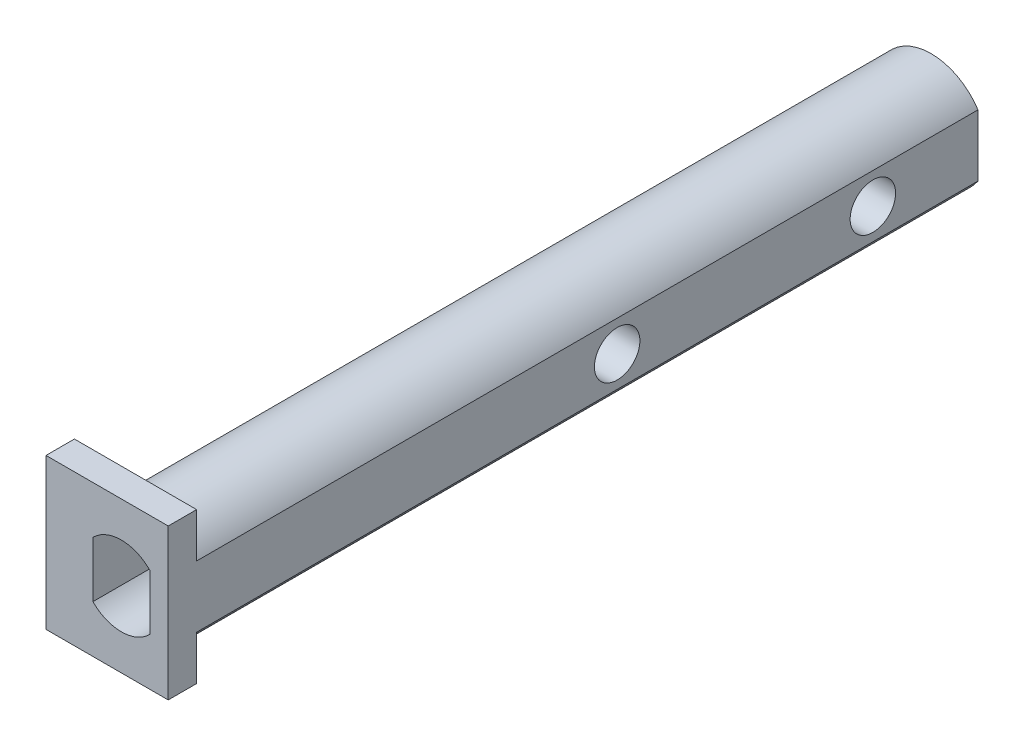
ISO-10303-21;
HEADER;
FILE_DESCRIPTION(('STEP AP214'),'2;1');
FILE_NAME('part.step','',(''),(''),'','','');
FILE_SCHEMA(('AUTOMOTIVE_DESIGN { 1 0 10303 214 1 1 1 1 }'));
ENDSEC;
DATA;
#1=APPLICATION_CONTEXT('core data for automotive mechanical design processes');
#2=APPLICATION_PROTOCOL_DEFINITION('international standard','automotive_design',2000,#1);
#3=PRODUCT_CONTEXT('',#1,'mechanical');
#4=PRODUCT('Part','Part','',(#3));
#5=PRODUCT_RELATED_PRODUCT_CATEGORY('part','',(#4));
#6=PRODUCT_DEFINITION_FORMATION('','',#4);
#7=PRODUCT_DEFINITION_CONTEXT('part definition',#1,'design');
#8=PRODUCT_DEFINITION('design','',#6,#7);
#9=PRODUCT_DEFINITION_SHAPE('','',#8);
#10=(LENGTH_UNIT() NAMED_UNIT(*) SI_UNIT(.MILLI.,.METRE.));
#11=(NAMED_UNIT(*) PLANE_ANGLE_UNIT() SI_UNIT($,.RADIAN.));
#12=(NAMED_UNIT(*) SI_UNIT($,.STERADIAN.) SOLID_ANGLE_UNIT());
#13=UNCERTAINTY_MEASURE_WITH_UNIT(LENGTH_MEASURE(1.E-05),#10,'distance_accuracy_value','');
#14=(GEOMETRIC_REPRESENTATION_CONTEXT(3) GLOBAL_UNCERTAINTY_ASSIGNED_CONTEXT((#13)) GLOBAL_UNIT_ASSIGNED_CONTEXT((#10,
#11,#12)) REPRESENTATION_CONTEXT('',''));
#15=CARTESIAN_POINT('',(0.,0.,0.));
#16=DIRECTION('',(0.,0.,1.));
#17=DIRECTION('',(1.,0.,0.));
#18=AXIS2_PLACEMENT_3D('',#15,#16,#17);
#19=CARTESIAN_POINT('',(-5.3033008588991,-5.30330085889911,2.));
#20=DIRECTION('',(1.,0.,0.));
#21=DIRECTION('',(0.,0.,-1.));
#22=AXIS2_PLACEMENT_3D('',#19,#20,#21);
#23=PLANE('',#22);
#24=DIRECTION('',(0.,-1.,0.));
#25=VECTOR('',#24,1.);
#26=CARTESIAN_POINT('',(-5.3033008588991,-5.30330085889911,0.));
#27=LINE('',#26,#25);
#28=CARTESIAN_POINT('',(-5.3033008588991,5.30330085889911,0.));
#29=VERTEX_POINT('',#28);
#30=CARTESIAN_POINT('',(-5.3033008588991,-5.30330085889911,0.));
#31=VERTEX_POINT('',#30);
#32=EDGE_CURVE('E127',#29,#31,#27,.T.);
#33=ORIENTED_EDGE('',*,*,#32,.T.);
#34=DIRECTION('',(0.,0.,-1.));
#35=VECTOR('',#34,1.);
#36=CARTESIAN_POINT('',(-5.3033008588991,-5.30330085889911,2.));
#37=LINE('',#36,#35);
#38=CARTESIAN_POINT('',(-5.3033008588991,-5.30330085889911,2.));
#39=VERTEX_POINT('',#38);
#40=EDGE_CURVE('E42',#39,#31,#37,.T.);
#41=ORIENTED_EDGE('',*,*,#40,.F.);
#42=DIRECTION('',(0.,-1.,0.));
#43=VECTOR('',#42,1.);
#44=CARTESIAN_POINT('',(-5.3033008588991,-5.30330085889911,2.));
#45=LINE('',#44,#43);
#46=CARTESIAN_POINT('',(-5.3033008588991,5.30330085889911,2.));
#47=VERTEX_POINT('',#46);
#48=EDGE_CURVE('E139',#47,#39,#45,.T.);
#49=ORIENTED_EDGE('',*,*,#48,.F.);
#50=DIRECTION('',(0.,0.,-1.));
#51=VECTOR('',#50,1.);
#52=CARTESIAN_POINT('',(-5.3033008588991,5.30330085889911,2.));
#53=LINE('',#52,#51);
#54=EDGE_CURVE('E147',#47,#29,#53,.T.);
#55=ORIENTED_EDGE('',*,*,#54,.T.);
#56=EDGE_LOOP('',(#33,#41,#49,#55));
#57=FACE_BOUND('',#56,.T.);
#58=ADVANCED_FACE('F34',(#57),#23,.F.);
#59=CARTESIAN_POINT('',(5.30330085889911,-5.3033008588991,2.));
#60=DIRECTION('',(0.,1.,0.));
#61=DIRECTION('',(-1.,0.,0.));
#62=AXIS2_PLACEMENT_3D('',#59,#60,#61);
#63=PLANE('',#62);
#64=DIRECTION('',(1.,0.,0.));
#65=VECTOR('',#64,1.);
#66=CARTESIAN_POINT('',(5.30330085889911,-5.3033008588991,0.));
#67=LINE('',#66,#65);
#68=CARTESIAN_POINT('',(3.3,-5.30330085889911,0.));
#69=VERTEX_POINT('',#68);
#70=EDGE_CURVE('E131',#31,#69,#67,.T.);
#71=ORIENTED_EDGE('',*,*,#70,.T.);
#72=DIRECTION('',(0.,0.,1.));
#73=VECTOR('',#72,1.);
#74=CARTESIAN_POINT('',(3.3,-5.3033008588991,2.));
#75=LINE('',#74,#73);
#76=CARTESIAN_POINT('',(3.3,-5.30330085889911,2.));
#77=VERTEX_POINT('',#76);
#78=EDGE_CURVE('E220',#69,#77,#75,.T.);
#79=ORIENTED_EDGE('',*,*,#78,.T.);
#80=DIRECTION('',(1.,0.,0.));
#81=VECTOR('',#80,1.);
#82=CARTESIAN_POINT('',(5.30330085889911,-5.3033008588991,2.));
#83=LINE('',#82,#81);
#84=EDGE_CURVE('E142',#39,#77,#83,.T.);
#85=ORIENTED_EDGE('',*,*,#84,.F.);
#86=ORIENTED_EDGE('',*,*,#40,.T.);
#87=EDGE_LOOP('',(#71,#79,#85,#86));
#88=FACE_BOUND('',#87,.T.);
#89=ADVANCED_FACE('F204',(#88),#63,.F.);
#90=CARTESIAN_POINT('',(5.30330085889911,5.30330085889911,2.));
#91=DIRECTION('',(0.,-1.,0.));
#92=DIRECTION('',(1.,0.,0.));
#93=AXIS2_PLACEMENT_3D('',#90,#91,#92);
#94=PLANE('',#93);
#95=DIRECTION('',(-1.,0.,0.));
#96=VECTOR('',#95,1.);
#97=CARTESIAN_POINT('',(5.30330085889911,5.30330085889911,2.));
#98=LINE('',#97,#96);
#99=CARTESIAN_POINT('',(3.3,5.30330085889911,2.));
#100=VERTEX_POINT('',#99);
#101=EDGE_CURVE('E146',#100,#47,#98,.T.);
#102=ORIENTED_EDGE('',*,*,#101,.F.);
#103=DIRECTION('',(0.,0.,-1.));
#104=VECTOR('',#103,1.);
#105=CARTESIAN_POINT('',(3.3,5.30330085889911,2.));
#106=LINE('',#105,#104);
#107=CARTESIAN_POINT('',(3.3,5.30330085889911,0.));
#108=VERTEX_POINT('',#107);
#109=EDGE_CURVE('E228',#100,#108,#106,.T.);
#110=ORIENTED_EDGE('',*,*,#109,.T.);
#111=DIRECTION('',(-1.,0.,0.));
#112=VECTOR('',#111,1.);
#113=CARTESIAN_POINT('',(5.30330085889911,5.30330085889911,0.));
#114=LINE('',#113,#112);
#115=EDGE_CURVE('E143',#108,#29,#114,.T.);
#116=ORIENTED_EDGE('',*,*,#115,.T.);
#117=ORIENTED_EDGE('',*,*,#54,.F.);
#118=EDGE_LOOP('',(#102,#110,#116,#117));
#119=FACE_BOUND('',#118,.T.);
#120=ADVANCED_FACE('F209',(#119),#94,.F.);
#121=CARTESIAN_POINT('',(0.,0.,2.));
#122=DIRECTION('',(0.,0.,1.));
#123=DIRECTION('',(1.,0.,0.));
#124=AXIS2_PLACEMENT_3D('',#121,#122,#123);
#125=PLANE('',#124);
#126=DIRECTION('',(0.,1.,0.));
#127=VECTOR('',#126,1.);
#128=CARTESIAN_POINT('',(3.3,6.81051230128347,2.));
#129=LINE('',#128,#127);
#130=EDGE_CURVE('E117',#77,#100,#129,.T.);
#131=ORIENTED_EDGE('',*,*,#130,.T.);
#132=ORIENTED_EDGE('',*,*,#101,.T.);
#133=ORIENTED_EDGE('',*,*,#48,.T.);
#134=ORIENTED_EDGE('',*,*,#84,.T.);
#135=EDGE_LOOP('',(#131,#132,#133,#134));
#136=FACE_BOUND('',#135,.T.);
#137=CARTESIAN_POINT('',(0.,0.,2.));
#138=DIRECTION('',(0.,0.,1.));
#139=DIRECTION('',(1.,0.,0.));
#140=AXIS2_PLACEMENT_3D('',#137,#138,#139);
#141=CIRCLE('',#140,2.8);
#142=CARTESIAN_POINT('',(2.,1.95959179422654,2.));
#143=VERTEX_POINT('',#142);
#144=CARTESIAN_POINT('',(-2.,1.95959179422654,2.));
#145=VERTEX_POINT('',#144);
#146=EDGE_CURVE('E58',#143,#145,#141,.T.);
#147=ORIENTED_EDGE('',*,*,#146,.F.);
#148=DIRECTION('',(0.,1.,0.));
#149=VECTOR('',#148,1.);
#150=CARTESIAN_POINT('',(2.,-1.95959179422654,2.));
#151=LINE('',#150,#149);
#152=CARTESIAN_POINT('',(2.,-1.95959179422654,2.));
#153=VERTEX_POINT('',#152);
#154=EDGE_CURVE('E238',#153,#143,#151,.T.);
#155=ORIENTED_EDGE('',*,*,#154,.F.);
#156=CARTESIAN_POINT('',(0.,0.,2.));
#157=DIRECTION('',(0.,0.,1.));
#158=DIRECTION('',(1.,0.,0.));
#159=AXIS2_PLACEMENT_3D('',#156,#157,#158);
#160=CIRCLE('',#159,2.8);
#161=CARTESIAN_POINT('',(-2.,-1.95959179422654,2.));
#162=VERTEX_POINT('',#161);
#163=EDGE_CURVE('E251',#162,#153,#160,.T.);
#164=ORIENTED_EDGE('',*,*,#163,.F.);
#165=DIRECTION('',(0.,-1.,0.));
#166=VECTOR('',#165,1.);
#167=CARTESIAN_POINT('',(-2.,-1.95959179422654,2.));
#168=LINE('',#167,#166);
#169=EDGE_CURVE('E248',#145,#162,#168,.T.);
#170=ORIENTED_EDGE('',*,*,#169,.F.);
#171=EDGE_LOOP('',(#147,#155,#164,#170));
#172=FACE_BOUND('',#171,.T.);
#173=ADVANCED_FACE('F223',(#136,#172),#125,.T.);
#174=CARTESIAN_POINT('',(0.,0.,0.));
#175=DIRECTION('',(0.,0.,1.));
#176=DIRECTION('',(1.,0.,0.));
#177=AXIS2_PLACEMENT_3D('',#174,#175,#176);
#178=PLANE('',#177);
#179=ORIENTED_EDGE('',*,*,#115,.F.);
#180=DIRECTION('',(0.,-1.,0.));
#181=VECTOR('',#180,1.);
#182=CARTESIAN_POINT('',(3.3,0.,0.));
#183=LINE('',#182,#181);
#184=CARTESIAN_POINT('',(3.3,2.17082933460924,0.));
#185=VERTEX_POINT('',#184);
#186=EDGE_CURVE('E123',#108,#185,#183,.T.);
#187=ORIENTED_EDGE('',*,*,#186,.T.);
#188=CARTESIAN_POINT('',(0.,0.,0.));
#189=DIRECTION('',(0.,0.,1.));
#190=DIRECTION('',(1.,0.,0.));
#191=AXIS2_PLACEMENT_3D('',#188,#189,#190);
#192=CIRCLE('',#191,3.95);
#193=CARTESIAN_POINT('',(3.3,-2.17082933460924,0.));
#194=VERTEX_POINT('',#193);
#195=EDGE_CURVE('E11',#194,#185,#192,.F.);
#196=ORIENTED_EDGE('',*,*,#195,.F.);
#197=EDGE_CURVE('E218',#194,#69,#183,.T.);
#198=ORIENTED_EDGE('',*,*,#197,.T.);
#199=ORIENTED_EDGE('',*,*,#70,.F.);
#200=ORIENTED_EDGE('',*,*,#32,.F.);
#201=EDGE_LOOP('',(#179,#187,#196,#198,#199,#200));
#202=FACE_BOUND('',#201,.T.);
#203=ADVANCED_FACE('F201',(#202),#178,.F.);
#204=CARTESIAN_POINT('',(0.,0.,-55.));
#205=DIRECTION('',(0.,0.,1.));
#206=DIRECTION('',(1.,0.,0.));
#207=AXIS2_PLACEMENT_3D('',#204,#205,#206);
#208=CYLINDRICAL_SURFACE('',#207,3.95);
#209=CARTESIAN_POINT('',(-3.95,0.,-49.2));
#210=CARTESIAN_POINT('',(-3.94999379590642,0.0859077321557278,-49.1999916550053));
#211=CARTESIAN_POINT('',(-3.94716465691992,0.171960508165551,-49.1930398920778));
#212=CARTESIAN_POINT('',(-3.93612262605428,0.341636442293053,-49.1654753191493));
#213=CARTESIAN_POINT('',(-3.92789527110763,0.425252441381751,-49.144825808078));
#214=CARTESIAN_POINT('',(-3.90694267817301,0.587325652133528,-49.0907442720734));
#215=CARTESIAN_POINT('',(-3.89423233289274,0.665798936827774,-49.0573545410689));
#216=CARTESIAN_POINT('',(-3.86556133416429,0.81595753399801,-48.9789102133528));
#217=CARTESIAN_POINT('',(-3.84960176596475,0.887645101239574,-48.9338595100754));
#218=CARTESIAN_POINT('',(-3.81518363905526,1.02574826393297,-48.8310848181557));
#219=CARTESIAN_POINT('',(-3.79664621239121,1.09179510750592,-48.772891931647));
#220=CARTESIAN_POINT('',(-3.75951612001247,1.21350548338532,-48.6464749128529));
#221=CARTESIAN_POINT('',(-3.7409234313628,1.26916382180316,-48.5782457931209));
#222=CARTESIAN_POINT('',(-3.70483728932636,1.37103573094096,-48.4298919890851));
#223=CARTESIAN_POINT('',(-3.68743345926833,1.41669853996952,-48.349365049844));
#224=CARTESIAN_POINT('',(-3.65693685641008,1.49366649852331,-48.1809639893364));
#225=CARTESIAN_POINT('',(-3.64384198477753,1.52497864098217,-48.0930934712556));
#226=CARTESIAN_POINT('',(-3.62429472437666,1.57085557676029,-47.9167394050751));
#227=CARTESIAN_POINT('',(-3.61756330485353,1.58612751431657,-47.8284718912971));
#228=CARTESIAN_POINT('',(-3.61069817456082,1.6016987007412,-47.6503901386177));
#229=CARTESIAN_POINT('',(-3.61056110427824,1.60200557361225,-47.5605767106184));
#230=CARTESIAN_POINT('',(-3.6166626916494,1.58817282611031,-47.3888209567203));
#231=CARTESIAN_POINT('',(-3.62244496832578,1.57506731922361,-47.3067759511718));
#232=CARTESIAN_POINT('',(-3.63896616369862,1.53650919256078,-47.1461687548221));
#233=CARTESIAN_POINT('',(-3.64970597192727,1.51105435689702,-47.0676071918307));
#234=CARTESIAN_POINT('',(-3.67517016363188,1.44803161287774,-46.914274076503));
#235=CARTESIAN_POINT('',(-3.68997237200738,1.41022403947253,-46.8396145330093));
#236=CARTESIAN_POINT('',(-3.72187311796671,1.32373763358919,-46.6974201713575));
#237=CARTESIAN_POINT('',(-3.7389725305385,1.27505465404351,-46.6298880855826));
#238=CARTESIAN_POINT('',(-3.77519514377456,1.16365466611768,-46.4982190793749));
#239=CARTESIAN_POINT('',(-3.79437119679803,1.10012994730087,-46.4347782069349));
#240=CARTESIAN_POINT('',(-3.83143400894788,0.963142929101401,-46.3192240338791));
#241=CARTESIAN_POINT('',(-3.84932049759423,0.889678554164187,-46.2671131050723));
#242=CARTESIAN_POINT('',(-3.88225775533471,0.732881158291159,-46.174752880911));
#243=CARTESIAN_POINT('',(-3.89724206881569,0.649375159500435,-46.1347718111597));
#244=CARTESIAN_POINT('',(-3.922181990994,0.476061375318491,-46.0696660350169));
#245=CARTESIAN_POINT('',(-3.93214022119439,0.386256902981339,-46.0445335827183));
#246=CARTESIAN_POINT('',(-3.94542459215147,0.208724533739429,-46.0112608744955));
#247=CARTESIAN_POINT('',(-3.94911512677478,0.121199066921185,-46.0021856046835));
#248=CARTESIAN_POINT('',(-3.95060071041494,-0.0541938764246967,-45.9985159867403));
#249=CARTESIAN_POINT('',(-3.94839733598265,-0.142061255216749,-46.0039177661707));
#250=CARTESIAN_POINT('',(-3.93858059347028,-0.311363708061816,-46.028366706555));
#251=CARTESIAN_POINT('',(-3.93122258224669,-0.392908191563032,-46.0467701266381));
#252=CARTESIAN_POINT('',(-3.91210369996182,-0.551672579317277,-46.0958180319386));
#253=CARTESIAN_POINT('',(-3.90034226583763,-0.628891929065906,-46.126464082647));
#254=CARTESIAN_POINT('',(-3.87310408548293,-0.779489223977342,-46.2001286880824));
#255=CARTESIAN_POINT('',(-3.85752418102271,-0.852675933877134,-46.2434988371676));
#256=CARTESIAN_POINT('',(-3.82433041096255,-0.990991615978242,-46.3409916578839));
#257=CARTESIAN_POINT('',(-3.80671572028317,-1.0561172972074,-46.3951186977487));
#258=CARTESIAN_POINT('',(-3.76988841835221,-1.18108814082411,-46.516881259089));
#259=CARTESIAN_POINT('',(-3.75064833634512,-1.24027776609804,-46.5851830301985));
#260=CARTESIAN_POINT('',(-3.71383176873331,-1.34652272225713,-46.7310804612434));
#261=CARTESIAN_POINT('',(-3.69625558731186,-1.39357583712715,-46.8086778146841));
#262=CARTESIAN_POINT('',(-3.66470495525766,-1.47456996129036,-46.9722589192486));
#263=CARTESIAN_POINT('',(-3.65077223389056,-1.50836110249075,-47.0583255038484));
#264=CARTESIAN_POINT('',(-3.62870953262366,-1.56070148841118,-47.2356641018007));
#265=CARTESIAN_POINT('',(-3.62057512140545,-1.57926237439182,-47.3269320822858));
#266=CARTESIAN_POINT('',(-3.61168155811158,-1.59948964035799,-47.5048536785259));
#267=CARTESIAN_POINT('',(-3.61042424247238,-1.60229755591094,-47.5913533604062));
#268=CARTESIAN_POINT('',(-3.61411655329279,-1.59395185398862,-47.7635327606292));
#269=CARTESIAN_POINT('',(-3.61906534523779,-1.58280011362214,-47.8492125876542));
#270=CARTESIAN_POINT('',(-3.63416797193795,-1.54779216749586,-48.0136630301261));
#271=CARTESIAN_POINT('',(-3.64409678783653,-1.52448358396572,-48.0925727976111));
#272=CARTESIAN_POINT('',(-3.66787680868113,-1.46634274381066,-48.2453893632212));
#273=CARTESIAN_POINT('',(-3.68172910265356,-1.43150728725855,-48.3192947652346));
#274=CARTESIAN_POINT('',(-3.71279532694713,-1.34896281261509,-48.4646902255109));
#275=CARTESIAN_POINT('',(-3.73015791598264,-1.30062288942569,-48.5357898002129));
#276=CARTESIAN_POINT('',(-3.76584691631165,-1.19335216104212,-48.6692260227832));
#277=CARTESIAN_POINT('',(-3.78417363020855,-1.13441801651281,-48.7315598965992));
#278=CARTESIAN_POINT('',(-3.82120608968873,-1.00292100616807,-48.8499972793726));
#279=CARTESIAN_POINT('',(-3.83985454069275,-0.929708413753424,-48.9054005829582));
#280=CARTESIAN_POINT('',(-3.87417673576788,-0.774322530110476,-49.0031559583822));
#281=CARTESIAN_POINT('',(-3.88984910570161,-0.692145127024248,-49.0455020069333));
#282=CARTESIAN_POINT('',(-3.91619878681009,-0.522605310186937,-49.1149682227071));
#283=CARTESIAN_POINT('',(-3.92696120811018,-0.435363361478893,-49.1423495919973));
#284=CARTESIAN_POINT('',(-3.94262733791631,-0.257151225703105,-49.18181810637));
#285=CARTESIAN_POINT('',(-3.94754956284656,-0.166193772628575,-49.1939535959662));
#286=CARTESIAN_POINT('',(-3.94976439647011,-0.0500034308579897,-49.1994164730771));
#287=CARTESIAN_POINT('',(-3.95000180602032,-0.025007860938832,-49.2000024292396));
#288=CARTESIAN_POINT('',(-3.95,0.,-49.2));
#289=B_SPLINE_CURVE_WITH_KNOTS('',3,(#209,#210,#211,#212,#213,#214,#215,#216,#217,#218,#219,
#220,#221,#222,#223,#224,#225,#226,#227,#228,#229,#230,#231,#232,#233,#234,#235,#236,#237,#238,
#239,#240,#241,#242,#243,#244,#245,#246,#247,#248,#249,#250,#251,#252,#253,#254,#255,#256,#257,
#258,#259,#260,#261,#262,#263,#264,#265,#266,#267,#268,#269,#270,#271,#272,#273,#274,#275,#276,
#277,#278,#279,#280,#281,#282,#283,#284,#285,#286,#287,#288),.UNSPECIFIED.,.T.,.F.,(4,2,2,2,2,2,
2,2,2,2,2,2,2,2,2,2,2,2,2,2,2,2,2,2,2,2,2,2,2,2,2,2,2,2,2,2,2,2,2,4),(0.,0.257655045685027,
0.516003243154265,0.773501156162766,1.03091320490201,1.29960683517439,1.5684344450968,
1.84960097097946,2.13063034122349,2.39867107103374,2.66657524516243,2.91527296827918,
3.16401533270003,3.41790287629517,3.67188739939658,3.94605133721535,4.22027261333428,
4.50017732626545,4.77993589531559,5.04278958082347,5.30557296311517,5.55618241623339,
5.8068239255751,6.06517547226243,6.32363214732916,6.59957820054954,6.87557460336945,
7.15460582542831,7.43342357050492,7.69174703190008,7.95003576112402,8.19758313300221,
8.44519928320903,8.70721714442973,8.969317739863,9.24903212422417,9.52887534793322,
9.80366390035451,10.0775788837508,10.1525826277793),.UNSPECIFIED.);
#290=CARTESIAN_POINT('',(-3.95,0.,-49.2));
#291=VERTEX_POINT('',#290);
#292=EDGE_CURVE('E163',#291,#291,#289,.T.);
#293=ORIENTED_EDGE('',*,*,#292,.T.);
#294=EDGE_LOOP('',(#293));
#295=FACE_BOUND('',#294,.T.);
#296=CARTESIAN_POINT('',(-3.95,0.,-31.2));
#297=CARTESIAN_POINT('',(-3.94999379590642,0.0859077321557284,-31.1999916550053));
#298=CARTESIAN_POINT('',(-3.94716465691992,0.171960508165553,-31.1930398920778));
#299=CARTESIAN_POINT('',(-3.93612262605428,0.341636442293055,-31.1654753191493));
#300=CARTESIAN_POINT('',(-3.92789527110763,0.425252441381753,-31.144825808078));
#301=CARTESIAN_POINT('',(-3.90694267817301,0.587325652133531,-31.0907442720734));
#302=CARTESIAN_POINT('',(-3.89423233289273,0.665798936827779,-31.0573545410689));
#303=CARTESIAN_POINT('',(-3.86556133416429,0.815957533998016,-30.9789102133528));
#304=CARTESIAN_POINT('',(-3.84960176596475,0.887645101239579,-30.9338595100754));
#305=CARTESIAN_POINT('',(-3.81518363905526,1.02574826393297,-30.8310848181557));
#306=CARTESIAN_POINT('',(-3.79664621239121,1.09179510750592,-30.772891931647));
#307=CARTESIAN_POINT('',(-3.75951612001247,1.21350548338532,-30.6464749128529));
#308=CARTESIAN_POINT('',(-3.7409234313628,1.26916382180316,-30.5782457931209));
#309=CARTESIAN_POINT('',(-3.70483728932636,1.37103573094096,-30.4298919890852));
#310=CARTESIAN_POINT('',(-3.68743345926833,1.41669853996952,-30.349365049844));
#311=CARTESIAN_POINT('',(-3.65693685641008,1.49366649852332,-30.1809639893365));
#312=CARTESIAN_POINT('',(-3.64384198477753,1.52497864098217,-30.0930934712556));
#313=CARTESIAN_POINT('',(-3.62429472437666,1.5708555767603,-29.9167394050751));
#314=CARTESIAN_POINT('',(-3.61756330485353,1.58612751431658,-29.8284718912971));
#315=CARTESIAN_POINT('',(-3.61069817456082,1.60169870074121,-29.6503901386177));
#316=CARTESIAN_POINT('',(-3.61056110427824,1.60200557361225,-29.5605767106184));
#317=CARTESIAN_POINT('',(-3.6166626916494,1.58817282611031,-29.3888209567203));
#318=CARTESIAN_POINT('',(-3.62244496832578,1.57506731922361,-29.3067759511717));
#319=CARTESIAN_POINT('',(-3.63896616369862,1.53650919256078,-29.1461687548221));
#320=CARTESIAN_POINT('',(-3.64970597192726,1.51105435689702,-29.0676071918307));
#321=CARTESIAN_POINT('',(-3.67517016363188,1.44803161287774,-28.914274076503));
#322=CARTESIAN_POINT('',(-3.68997237200737,1.41022403947254,-28.8396145330093));
#323=CARTESIAN_POINT('',(-3.72187311796671,1.3237376335892,-28.6974201713575));
#324=CARTESIAN_POINT('',(-3.7389725305385,1.27505465404351,-28.6298880855826));
#325=CARTESIAN_POINT('',(-3.77519514377456,1.16365466611768,-28.4982190793749));
#326=CARTESIAN_POINT('',(-3.79437119679803,1.10012994730087,-28.4347782069349));
#327=CARTESIAN_POINT('',(-3.83143400894788,0.963142929101403,-28.3192240338791));
#328=CARTESIAN_POINT('',(-3.84932049759423,0.889678554164188,-28.2671131050723));
#329=CARTESIAN_POINT('',(-3.88225775533471,0.732881158291159,-28.1747528809109));
#330=CARTESIAN_POINT('',(-3.89724206881569,0.649375159500433,-28.1347718111597));
#331=CARTESIAN_POINT('',(-3.922181990994,0.476061375318488,-28.0696660350169));
#332=CARTESIAN_POINT('',(-3.93214022119439,0.386256902981336,-28.0445335827183));
#333=CARTESIAN_POINT('',(-3.94542459215147,0.208724533739426,-28.0112608744955));
#334=CARTESIAN_POINT('',(-3.94911512677478,0.121199066921182,-28.0021856046835));
#335=CARTESIAN_POINT('',(-3.95060071041494,-0.0541938764246999,-27.9985159867403));
#336=CARTESIAN_POINT('',(-3.94839733598265,-0.142061255216753,-28.0039177661707));
#337=CARTESIAN_POINT('',(-3.93858059347028,-0.31136370806182,-28.028366706555));
#338=CARTESIAN_POINT('',(-3.93122258224669,-0.392908191563037,-28.0467701266381));
#339=CARTESIAN_POINT('',(-3.91210369996182,-0.551672579317282,-28.0958180319386));
#340=CARTESIAN_POINT('',(-3.90034226583763,-0.628891929065911,-28.126464082647));
#341=CARTESIAN_POINT('',(-3.87310408548293,-0.779489223977345,-28.2001286880824));
#342=CARTESIAN_POINT('',(-3.85752418102271,-0.852675933877137,-28.2434988371676));
#343=CARTESIAN_POINT('',(-3.82433041096255,-0.990991615978245,-28.3409916578839));
#344=CARTESIAN_POINT('',(-3.80671572028317,-1.0561172972074,-28.3951186977487));
#345=CARTESIAN_POINT('',(-3.76988841835221,-1.18108814082412,-28.516881259089));
#346=CARTESIAN_POINT('',(-3.75064833634512,-1.24027776609804,-28.5851830301985));
#347=CARTESIAN_POINT('',(-3.71383176873331,-1.34652272225713,-28.7310804612434));
#348=CARTESIAN_POINT('',(-3.69625558731186,-1.39357583712716,-28.8086778146841));
#349=CARTESIAN_POINT('',(-3.66470495525766,-1.47456996129036,-28.9722589192486));
#350=CARTESIAN_POINT('',(-3.65077223389055,-1.50836110249075,-29.0583255038484));
#351=CARTESIAN_POINT('',(-3.62870953262366,-1.56070148841118,-29.2356641018007));
#352=CARTESIAN_POINT('',(-3.62057512140545,-1.57926237439182,-29.3269320822858));
#353=CARTESIAN_POINT('',(-3.61168155811158,-1.599489640358,-29.5048536785259));
#354=CARTESIAN_POINT('',(-3.61042424247238,-1.60229755591095,-29.5913533604062));
#355=CARTESIAN_POINT('',(-3.61411655329279,-1.59395185398862,-29.7635327606292));
#356=CARTESIAN_POINT('',(-3.61906534523779,-1.58280011362214,-29.8492125876542));
#357=CARTESIAN_POINT('',(-3.63416797193795,-1.54779216749586,-30.0136630301262));
#358=CARTESIAN_POINT('',(-3.64409678783653,-1.52448358396572,-30.0925727976111));
#359=CARTESIAN_POINT('',(-3.66787680868112,-1.46634274381066,-30.2453893632212));
#360=CARTESIAN_POINT('',(-3.68172910265356,-1.43150728725855,-30.3192947652346));
#361=CARTESIAN_POINT('',(-3.71279532694713,-1.3489628126151,-30.4646902255109));
#362=CARTESIAN_POINT('',(-3.73015791598264,-1.3006228894257,-30.5357898002129));
#363=CARTESIAN_POINT('',(-3.76584691631165,-1.19335216104213,-30.6692260227832));
#364=CARTESIAN_POINT('',(-3.78417363020855,-1.13441801651281,-30.7315598965992));
#365=CARTESIAN_POINT('',(-3.82120608968873,-1.00292100616808,-30.8499972793726));
#366=CARTESIAN_POINT('',(-3.83985454069275,-0.929708413753423,-30.9054005829582));
#367=CARTESIAN_POINT('',(-3.87417673576788,-0.774322530110471,-31.0031559583822));
#368=CARTESIAN_POINT('',(-3.88984910570161,-0.692145127024244,-31.0455020069333));
#369=CARTESIAN_POINT('',(-3.91619878681009,-0.522605310186934,-31.1149682227071));
#370=CARTESIAN_POINT('',(-3.92696120811018,-0.43536336147889,-31.1423495919973));
#371=CARTESIAN_POINT('',(-3.94262733791631,-0.257151225703103,-31.18181810637));
#372=CARTESIAN_POINT('',(-3.94754956284656,-0.166193772628575,-31.1939535959662));
#373=CARTESIAN_POINT('',(-3.94976439647011,-0.05000343085799,-31.1994164730771));
#374=CARTESIAN_POINT('',(-3.95000180602032,-0.0250078609388322,-31.2000024292396));
#375=CARTESIAN_POINT('',(-3.95,0.,-31.2));
#376=B_SPLINE_CURVE_WITH_KNOTS('',3,(#296,#297,#298,#299,#300,#301,#302,#303,#304,#305,#306,
#307,#308,#309,#310,#311,#312,#313,#314,#315,#316,#317,#318,#319,#320,#321,#322,#323,#324,#325,
#326,#327,#328,#329,#330,#331,#332,#333,#334,#335,#336,#337,#338,#339,#340,#341,#342,#343,#344,
#345,#346,#347,#348,#349,#350,#351,#352,#353,#354,#355,#356,#357,#358,#359,#360,#361,#362,#363,
#364,#365,#366,#367,#368,#369,#370,#371,#372,#373,#374,#375),.UNSPECIFIED.,.T.,.F.,(4,2,2,2,2,2,
2,2,2,2,2,2,2,2,2,2,2,2,2,2,2,2,2,2,2,2,2,2,2,2,2,2,2,2,2,2,2,2,2,4),(0.,0.257655045685028,
0.516003243154268,0.773501156162772,1.03091320490202,1.2996068351744,1.5684344450968,
1.84960097097947,2.1306303412235,2.39867107103377,2.66657524516244,2.91527296827919,
3.16401533270004,3.41790287629517,3.67188739939659,3.94605133721536,4.22027261333429,
4.50017732626547,4.7799358953156,5.04278958082349,5.30557296311519,5.55618241623341,
5.80682392557512,6.06517547226244,6.32363214732917,6.59957820054956,6.87557460336947,
7.15460582542833,7.43342357050493,7.69174703190009,7.95003576112405,8.19758313300223,
8.44519928320904,8.70721714442974,8.96931773986302,9.2490321242242,9.52887534793325,
9.80366390035453,10.0775788837508,10.1525826277793),.UNSPECIFIED.);
#377=CARTESIAN_POINT('',(-3.95,0.,-31.2));
#378=VERTEX_POINT('',#377);
#379=EDGE_CURVE('E156',#378,#378,#376,.T.);
#380=ORIENTED_EDGE('',*,*,#379,.T.);
#381=EDGE_LOOP('',(#380));
#382=FACE_BOUND('',#381,.T.);
#383=CARTESIAN_POINT('',(0.,0.,-55.));
#384=DIRECTION('',(0.,0.,-1.));
#385=DIRECTION('',(-1.,0.,0.));
#386=AXIS2_PLACEMENT_3D('',#383,#384,#385);
#387=CIRCLE('',#386,3.95);
#388=CARTESIAN_POINT('',(3.3,-2.17082933460924,-55.));
#389=VERTEX_POINT('',#388);
#390=CARTESIAN_POINT('',(3.3,2.17082933460924,-55.));
#391=VERTEX_POINT('',#390);
#392=EDGE_CURVE('E121',#389,#391,#387,.T.);
#393=ORIENTED_EDGE('',*,*,#392,.F.);
#394=DIRECTION('',(0.,0.,1.));
#395=VECTOR('',#394,1.);
#396=CARTESIAN_POINT('',(3.3,-2.17082933460924,-55.));
#397=LINE('',#396,#395);
#398=EDGE_CURVE('E50',#389,#194,#397,.T.);
#399=ORIENTED_EDGE('',*,*,#398,.T.);
#400=ORIENTED_EDGE('',*,*,#195,.T.);
#401=DIRECTION('',(0.,0.,1.));
#402=VECTOR('',#401,1.);
#403=CARTESIAN_POINT('',(3.3,2.17082933460924,-55.));
#404=LINE('',#403,#402);
#405=EDGE_CURVE('E112',#185,#391,#404,.F.);
#406=ORIENTED_EDGE('',*,*,#405,.T.);
#407=EDGE_LOOP('',(#393,#399,#400,#406));
#408=FACE_BOUND('',#407,.T.);
#409=ADVANCED_FACE('F120',(#295,#382,#408),#208,.T.);
#410=CARTESIAN_POINT('',(0.,0.,-55.));
#411=DIRECTION('',(0.,0.,-1.));
#412=DIRECTION('',(-1.,0.,0.));
#413=AXIS2_PLACEMENT_3D('',#410,#411,#412);
#414=PLANE('',#413);
#415=DIRECTION('',(0.,1.,0.));
#416=VECTOR('',#415,1.);
#417=CARTESIAN_POINT('',(3.3,6.81051230128347,-55.));
#418=LINE('',#417,#416);
#419=EDGE_CURVE('E109',#389,#391,#418,.T.);
#420=ORIENTED_EDGE('',*,*,#419,.F.);
#421=ORIENTED_EDGE('',*,*,#392,.T.);
#422=EDGE_LOOP('',(#420,#421));
#423=FACE_BOUND('',#422,.T.);
#424=ADVANCED_FACE('F126',(#423),#414,.T.);
#425=CARTESIAN_POINT('',(0.,0.,-8.));
#426=DIRECTION('',(0.,0.,1.));
#427=DIRECTION('',(1.,0.,0.));
#428=AXIS2_PLACEMENT_3D('',#425,#426,#427);
#429=CYLINDRICAL_SURFACE('',#428,2.8);
#430=ORIENTED_EDGE('',*,*,#146,.T.);
#431=DIRECTION('',(0.,0.,1.));
#432=VECTOR('',#431,1.);
#433=CARTESIAN_POINT('',(-2.,1.95959179422654,-8.));
#434=LINE('',#433,#432);
#435=CARTESIAN_POINT('',(-2.,1.95959179422654,-8.));
#436=VERTEX_POINT('',#435);
#437=EDGE_CURVE('E137',#436,#145,#434,.T.);
#438=ORIENTED_EDGE('',*,*,#437,.F.);
#439=CARTESIAN_POINT('',(0.,0.,-8.));
#440=DIRECTION('',(0.,0.,1.));
#441=DIRECTION('',(1.,0.,0.));
#442=AXIS2_PLACEMENT_3D('',#439,#440,#441);
#443=CIRCLE('',#442,2.8);
#444=CARTESIAN_POINT('',(2.,1.95959179422654,-8.));
#445=VERTEX_POINT('',#444);
#446=EDGE_CURVE('E234',#445,#436,#443,.T.);
#447=ORIENTED_EDGE('',*,*,#446,.F.);
#448=DIRECTION('',(0.,0.,1.));
#449=VECTOR('',#448,1.);
#450=CARTESIAN_POINT('',(2.,1.95959179422654,-8.));
#451=LINE('',#450,#449);
#452=EDGE_CURVE('E128',#445,#143,#451,.T.);
#453=ORIENTED_EDGE('',*,*,#452,.T.);
#454=EDGE_LOOP('',(#430,#438,#447,#453));
#455=FACE_BOUND('',#454,.T.);
#456=ADVANCED_FACE('F188',(#455),#429,.F.);
#457=CARTESIAN_POINT('',(2.,-1.95959179422654,-8.));
#458=DIRECTION('',(1.,0.,0.));
#459=DIRECTION('',(0.,0.,-1.));
#460=AXIS2_PLACEMENT_3D('',#457,#458,#459);
#461=PLANE('',#460);
#462=ORIENTED_EDGE('',*,*,#154,.T.);
#463=ORIENTED_EDGE('',*,*,#452,.F.);
#464=DIRECTION('',(0.,1.,0.));
#465=VECTOR('',#464,1.);
#466=CARTESIAN_POINT('',(2.,-1.95959179422654,-8.));
#467=LINE('',#466,#465);
#468=CARTESIAN_POINT('',(2.,-1.95959179422654,-8.));
#469=VERTEX_POINT('',#468);
#470=EDGE_CURVE('E244',#469,#445,#467,.T.);
#471=ORIENTED_EDGE('',*,*,#470,.F.);
#472=DIRECTION('',(0.,0.,1.));
#473=VECTOR('',#472,1.);
#474=CARTESIAN_POINT('',(2.,-1.95959179422654,-8.));
#475=LINE('',#474,#473);
#476=EDGE_CURVE('E133',#469,#153,#475,.T.);
#477=ORIENTED_EDGE('',*,*,#476,.T.);
#478=EDGE_LOOP('',(#462,#463,#471,#477));
#479=FACE_BOUND('',#478,.T.);
#480=ADVANCED_FACE('F184',(#479),#461,.F.);
#481=CARTESIAN_POINT('',(0.,0.,-8.));
#482=DIRECTION('',(0.,0.,1.));
#483=DIRECTION('',(1.,0.,0.));
#484=AXIS2_PLACEMENT_3D('',#481,#482,#483);
#485=CYLINDRICAL_SURFACE('',#484,2.8);
#486=ORIENTED_EDGE('',*,*,#163,.T.);
#487=ORIENTED_EDGE('',*,*,#476,.F.);
#488=CARTESIAN_POINT('',(0.,0.,-8.));
#489=DIRECTION('',(0.,0.,1.));
#490=DIRECTION('',(1.,0.,0.));
#491=AXIS2_PLACEMENT_3D('',#488,#489,#490);
#492=CIRCLE('',#491,2.8);
#493=CARTESIAN_POINT('',(-2.,-1.95959179422654,-8.));
#494=VERTEX_POINT('',#493);
#495=EDGE_CURVE('E241',#494,#469,#492,.T.);
#496=ORIENTED_EDGE('',*,*,#495,.F.);
#497=DIRECTION('',(0.,0.,1.));
#498=VECTOR('',#497,1.);
#499=CARTESIAN_POINT('',(-2.,-1.95959179422654,-8.));
#500=LINE('',#499,#498);
#501=EDGE_CURVE('E256',#494,#162,#500,.T.);
#502=ORIENTED_EDGE('',*,*,#501,.T.);
#503=EDGE_LOOP('',(#486,#487,#496,#502));
#504=FACE_BOUND('',#503,.T.);
#505=ADVANCED_FACE('F187',(#504),#485,.F.);
#506=CARTESIAN_POINT('',(-2.,-1.95959179422654,-8.));
#507=DIRECTION('',(-1.,0.,0.));
#508=DIRECTION('',(0.,0.,1.));
#509=AXIS2_PLACEMENT_3D('',#506,#507,#508);
#510=PLANE('',#509);
#511=ORIENTED_EDGE('',*,*,#169,.T.);
#512=ORIENTED_EDGE('',*,*,#501,.F.);
#513=DIRECTION('',(0.,-1.,0.));
#514=VECTOR('',#513,1.);
#515=CARTESIAN_POINT('',(-2.,-1.95959179422654,-8.));
#516=LINE('',#515,#514);
#517=EDGE_CURVE('E237',#436,#494,#516,.T.);
#518=ORIENTED_EDGE('',*,*,#517,.F.);
#519=ORIENTED_EDGE('',*,*,#437,.T.);
#520=EDGE_LOOP('',(#511,#512,#518,#519));
#521=FACE_BOUND('',#520,.T.);
#522=ADVANCED_FACE('F182',(#521),#510,.F.);
#523=CARTESIAN_POINT('',(0.,0.,-8.));
#524=DIRECTION('',(0.,0.,1.));
#525=DIRECTION('',(1.,0.,0.));
#526=AXIS2_PLACEMENT_3D('',#523,#524,#525);
#527=PLANE('',#526);
#528=ORIENTED_EDGE('',*,*,#446,.T.);
#529=ORIENTED_EDGE('',*,*,#517,.T.);
#530=ORIENTED_EDGE('',*,*,#495,.T.);
#531=ORIENTED_EDGE('',*,*,#470,.T.);
#532=EDGE_LOOP('',(#528,#529,#530,#531));
#533=FACE_BOUND('',#532,.T.);
#534=ADVANCED_FACE('F176',(#533),#527,.T.);
#535=CARTESIAN_POINT('',(-26.,0.,-29.6));
#536=DIRECTION('',(1.,0.,0.));
#537=DIRECTION('',(0.,0.,-1.));
#538=AXIS2_PLACEMENT_3D('',#535,#536,#537);
#539=CYLINDRICAL_SURFACE('',#538,1.6);
#540=CARTESIAN_POINT('',(3.3,0.,-29.6));
#541=DIRECTION('',(-1.,0.,0.));
#542=DIRECTION('',(0.,0.,1.));
#543=AXIS2_PLACEMENT_3D('',#540,#541,#542);
#544=CIRCLE('',#543,1.6);
#545=CARTESIAN_POINT('',(3.3,0.,-28.));
#546=VERTEX_POINT('',#545);
#547=EDGE_CURVE('E124',#546,#546,#544,.F.);
#548=ORIENTED_EDGE('',*,*,#547,.T.);
#549=EDGE_LOOP('',(#548));
#550=FACE_BOUND('',#549,.T.);
#551=ORIENTED_EDGE('',*,*,#379,.F.);
#552=EDGE_LOOP('',(#551));
#553=FACE_BOUND('',#552,.T.);
#554=ADVANCED_FACE('F171',(#550,#553),#539,.F.);
#555=CARTESIAN_POINT('',(-26.,0.,-47.6));
#556=DIRECTION('',(1.,0.,0.));
#557=DIRECTION('',(0.,0.,-1.));
#558=AXIS2_PLACEMENT_3D('',#555,#556,#557);
#559=CYLINDRICAL_SURFACE('',#558,1.6);
#560=CARTESIAN_POINT('',(3.3,0.,-47.6));
#561=DIRECTION('',(-1.,0.,0.));
#562=DIRECTION('',(0.,0.,1.));
#563=AXIS2_PLACEMENT_3D('',#560,#561,#562);
#564=CIRCLE('',#563,1.6);
#565=CARTESIAN_POINT('',(3.3,0.,-46.));
#566=VERTEX_POINT('',#565);
#567=EDGE_CURVE('E37',#566,#566,#564,.F.);
#568=ORIENTED_EDGE('',*,*,#567,.T.);
#569=EDGE_LOOP('',(#568));
#570=FACE_BOUND('',#569,.T.);
#571=ORIENTED_EDGE('',*,*,#292,.F.);
#572=EDGE_LOOP('',(#571));
#573=FACE_BOUND('',#572,.T.);
#574=ADVANCED_FACE('F175',(#570,#573),#559,.F.);
#575=CARTESIAN_POINT('',(3.3,6.81051230128347,2.));
#576=DIRECTION('',(-1.,0.,0.));
#577=DIRECTION('',(0.,0.,1.));
#578=AXIS2_PLACEMENT_3D('',#575,#576,#577);
#579=PLANE('',#578);
#580=ORIENTED_EDGE('',*,*,#567,.F.);
#581=EDGE_LOOP('',(#580));
#582=FACE_BOUND('',#581,.T.);
#583=ORIENTED_EDGE('',*,*,#547,.F.);
#584=EDGE_LOOP('',(#583));
#585=FACE_BOUND('',#584,.T.);
#586=ORIENTED_EDGE('',*,*,#197,.F.);
#587=ORIENTED_EDGE('',*,*,#398,.F.);
#588=ORIENTED_EDGE('',*,*,#419,.T.);
#589=ORIENTED_EDGE('',*,*,#405,.F.);
#590=ORIENTED_EDGE('',*,*,#186,.F.);
#591=ORIENTED_EDGE('',*,*,#109,.F.);
#592=ORIENTED_EDGE('',*,*,#130,.F.);
#593=ORIENTED_EDGE('',*,*,#78,.F.);
#594=EDGE_LOOP('',(#586,#587,#588,#589,#590,#591,#592,#593));
#595=FACE_BOUND('',#594,.T.);
#596=ADVANCED_FACE('F111',(#582,#585,#595),#579,.F.);
#597=CLOSED_SHELL('',(#58,#89,#120,#173,#203,#409,#424,#456,#480,#505,#522,#534,#554,#574,#596));
#598=MANIFOLD_SOLID_BREP('B2',#597);
#599=ADVANCED_BREP_SHAPE_REPRESENTATION('',(#18,#598),#14);
#600=SHAPE_DEFINITION_REPRESENTATION(#9,#599);
ENDSEC;
END-ISO-10303-21;
